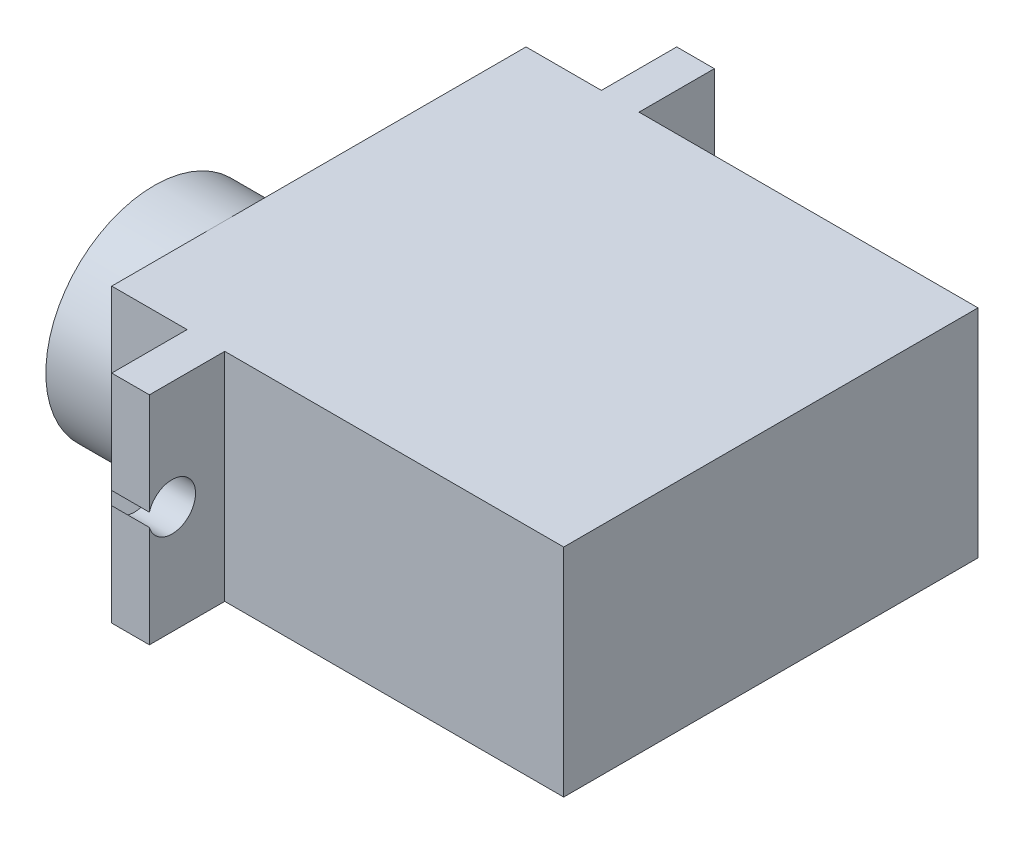
ISO-10303-21;
HEADER;
FILE_DESCRIPTION(('STEP AP214'),'2;1');
FILE_NAME('part.step','',(''),(''),'','','');
FILE_SCHEMA(('AUTOMOTIVE_DESIGN { 1 0 10303 214 1 1 1 1 }'));
ENDSEC;
DATA;
#1=APPLICATION_CONTEXT('core data for automotive mechanical design processes');
#2=APPLICATION_PROTOCOL_DEFINITION('international standard','automotive_design',2000,#1);
#3=PRODUCT_CONTEXT('',#1,'mechanical');
#4=PRODUCT('Part','Part','',(#3));
#5=PRODUCT_RELATED_PRODUCT_CATEGORY('part','',(#4));
#6=PRODUCT_DEFINITION_FORMATION('','',#4);
#7=PRODUCT_DEFINITION_CONTEXT('part definition',#1,'design');
#8=PRODUCT_DEFINITION('design','',#6,#7);
#9=PRODUCT_DEFINITION_SHAPE('','',#8);
#10=(LENGTH_UNIT() NAMED_UNIT(*) SI_UNIT(.MILLI.,.METRE.));
#11=(NAMED_UNIT(*) PLANE_ANGLE_UNIT() SI_UNIT($,.RADIAN.));
#12=(NAMED_UNIT(*) SI_UNIT($,.STERADIAN.) SOLID_ANGLE_UNIT());
#13=UNCERTAINTY_MEASURE_WITH_UNIT(LENGTH_MEASURE(1.E-05),#10,'distance_accuracy_value','');
#14=(GEOMETRIC_REPRESENTATION_CONTEXT(3) GLOBAL_UNCERTAINTY_ASSIGNED_CONTEXT((#13)) GLOBAL_UNIT_ASSIGNED_CONTEXT((#10,
#11,#12)) REPRESENTATION_CONTEXT('',''));
#15=CARTESIAN_POINT('',(0.,0.,0.));
#16=DIRECTION('',(0.,0.,1.));
#17=DIRECTION('',(1.,0.,0.));
#18=AXIS2_PLACEMENT_3D('',#15,#16,#17);
#19=CARTESIAN_POINT('',(-20.,11.5,-26.));
#20=DIRECTION('',(0.,0.,1.));
#21=DIRECTION('',(1.,0.,0.));
#22=AXIS2_PLACEMENT_3D('',#19,#20,#21);
#23=PLANE('',#22);
#24=DIRECTION('',(0.,-1.,0.));
#25=VECTOR('',#24,1.);
#26=CARTESIAN_POINT('',(-18.,11.5,-26.));
#27=LINE('',#26,#25);
#28=CARTESIAN_POINT('',(-18.,11.5,-26.));
#29=VERTEX_POINT('',#28);
#30=CARTESIAN_POINT('',(-18.,6.10000000000001,-26.));
#31=VERTEX_POINT('',#30);
#32=EDGE_CURVE('E211',#29,#31,#27,.T.);
#33=ORIENTED_EDGE('',*,*,#32,.T.);
#34=DIRECTION('',(-1.,0.,0.));
#35=VECTOR('',#34,1.);
#36=CARTESIAN_POINT('',(-16.5,6.1,-26.));
#37=LINE('',#36,#35);
#38=CARTESIAN_POINT('',(-20.,6.10000000000001,-26.));
#39=VERTEX_POINT('',#38);
#40=EDGE_CURVE('E345',#31,#39,#37,.T.);
#41=ORIENTED_EDGE('',*,*,#40,.T.);
#42=DIRECTION('',(0.,-1.,0.));
#43=VECTOR('',#42,1.);
#44=CARTESIAN_POINT('',(-20.,11.5,-26.));
#45=LINE('',#44,#43);
#46=CARTESIAN_POINT('',(-20.,11.5,-26.));
#47=VERTEX_POINT('',#46);
#48=EDGE_CURVE('E207',#47,#39,#45,.T.);
#49=ORIENTED_EDGE('',*,*,#48,.F.);
#50=DIRECTION('',(-1.,0.,0.));
#51=VECTOR('',#50,1.);
#52=CARTESIAN_POINT('',(-20.,11.5,-26.));
#53=LINE('',#52,#51);
#54=EDGE_CURVE('E265',#29,#47,#53,.T.);
#55=ORIENTED_EDGE('',*,*,#54,.F.);
#56=EDGE_LOOP('',(#33,#41,#49,#55));
#57=FACE_BOUND('',#56,.T.);
#58=ADVANCED_FACE('F36',(#57),#23,.F.);
#59=CARTESIAN_POINT('',(-20.,11.5,4.));
#60=DIRECTION('',(0.,0.,-1.));
#61=DIRECTION('',(-1.,0.,0.));
#62=AXIS2_PLACEMENT_3D('',#59,#60,#61);
#63=PLANE('',#62);
#64=DIRECTION('',(0.,-1.,0.));
#65=VECTOR('',#64,1.);
#66=CARTESIAN_POINT('',(-18.,11.5,4.));
#67=LINE('',#66,#65);
#68=CARTESIAN_POINT('',(-18.,5.4,4.));
#69=VERTEX_POINT('',#68);
#70=CARTESIAN_POINT('',(-18.,0.,4.));
#71=VERTEX_POINT('',#70);
#72=EDGE_CURVE('E316',#69,#71,#67,.T.);
#73=ORIENTED_EDGE('',*,*,#72,.F.);
#74=DIRECTION('',(-1.,0.,0.));
#75=VECTOR('',#74,1.);
#76=CARTESIAN_POINT('',(-16.5,5.39999999999999,4.));
#77=LINE('',#76,#75);
#78=CARTESIAN_POINT('',(-20.,5.4,4.));
#79=VERTEX_POINT('',#78);
#80=EDGE_CURVE('E58',#69,#79,#77,.T.);
#81=ORIENTED_EDGE('',*,*,#80,.T.);
#82=DIRECTION('',(0.,-1.,0.));
#83=VECTOR('',#82,1.);
#84=CARTESIAN_POINT('',(-20.,11.5,4.));
#85=LINE('',#84,#83);
#86=CARTESIAN_POINT('',(-20.,0.,4.));
#87=VERTEX_POINT('',#86);
#88=EDGE_CURVE('E184',#79,#87,#85,.T.);
#89=ORIENTED_EDGE('',*,*,#88,.T.);
#90=DIRECTION('',(1.,0.,0.));
#91=VECTOR('',#90,1.);
#92=CARTESIAN_POINT('',(-20.,0.,4.));
#93=LINE('',#92,#91);
#94=EDGE_CURVE('E307',#87,#71,#93,.T.);
#95=ORIENTED_EDGE('',*,*,#94,.T.);
#96=EDGE_LOOP('',(#73,#81,#89,#95));
#97=FACE_BOUND('',#96,.T.);
#98=ADVANCED_FACE('F338',(#97),#63,.F.);
#99=CARTESIAN_POINT('',(-24.,11.5,0.));
#100=DIRECTION('',(1.,0.,0.));
#101=DIRECTION('',(0.,0.,-1.));
#102=AXIS2_PLACEMENT_3D('',#99,#100,#101);
#103=PLANE('',#102);
#104=CARTESIAN_POINT('',(-24.,5.75,-11.140964663212));
#105=DIRECTION('',(-1.,0.,0.));
#106=DIRECTION('',(0.,0.,1.));
#107=AXIS2_PLACEMENT_3D('',#104,#105,#106);
#108=CIRCLE('',#107,2.);
#109=CARTESIAN_POINT('',(-24.,7.75,-11.140964663212));
#110=VERTEX_POINT('',#109);
#111=CARTESIAN_POINT('',(-24.,3.75,-11.140964663212));
#112=VERTEX_POINT('',#111);
#113=EDGE_CURVE('E233',#110,#112,#108,.T.);
#114=ORIENTED_EDGE('',*,*,#113,.F.);
#115=CARTESIAN_POINT('',(-24.,5.75,-5.75));
#116=DIRECTION('',(-1.,0.,0.));
#117=DIRECTION('',(0.,0.,1.));
#118=AXIS2_PLACEMENT_3D('',#115,#116,#117);
#119=CIRCLE('',#118,5.75);
#120=CARTESIAN_POINT('',(-24.,11.5,-5.75));
#121=VERTEX_POINT('',#120);
#122=EDGE_CURVE('E219',#121,#110,#119,.T.);
#123=ORIENTED_EDGE('',*,*,#122,.F.);
#124=DIRECTION('',(0.,0.,1.));
#125=VECTOR('',#124,1.);
#126=CARTESIAN_POINT('',(-24.,11.5,0.));
#127=LINE('',#126,#125);
#128=CARTESIAN_POINT('',(-24.,11.5,-22.));
#129=VERTEX_POINT('',#128);
#130=EDGE_CURVE('E272',#129,#121,#127,.T.);
#131=ORIENTED_EDGE('',*,*,#130,.F.);
#132=DIRECTION('',(0.,-1.,0.));
#133=VECTOR('',#132,1.);
#134=CARTESIAN_POINT('',(-24.,11.5,-22.));
#135=LINE('',#134,#133);
#136=CARTESIAN_POINT('',(-24.,0.,-22.));
#137=VERTEX_POINT('',#136);
#138=EDGE_CURVE('E200',#129,#137,#135,.T.);
#139=ORIENTED_EDGE('',*,*,#138,.T.);
#140=DIRECTION('',(0.,0.,1.));
#141=VECTOR('',#140,1.);
#142=CARTESIAN_POINT('',(-24.,0.,0.));
#143=LINE('',#142,#141);
#144=CARTESIAN_POINT('',(-24.,0.,-5.75));
#145=VERTEX_POINT('',#144);
#146=EDGE_CURVE('E300',#137,#145,#143,.T.);
#147=ORIENTED_EDGE('',*,*,#146,.T.);
#148=EDGE_CURVE('E226',#112,#145,#119,.T.);
#149=ORIENTED_EDGE('',*,*,#148,.F.);
#150=EDGE_LOOP('',(#114,#123,#131,#139,#147,#149));
#151=FACE_BOUND('',#150,.T.);
#152=ADVANCED_FACE('F375',(#151),#103,.F.);
#153=CARTESIAN_POINT('',(-24.,5.75,0.));
#154=VERTEX_POINT('',#153);
#155=EDGE_CURVE('E220',#145,#154,#119,.T.);
#156=ORIENTED_EDGE('',*,*,#155,.F.);
#157=CARTESIAN_POINT('',(-24.,0.,0.));
#158=VERTEX_POINT('',#157);
#159=EDGE_CURVE('E299',#145,#158,#143,.T.);
#160=ORIENTED_EDGE('',*,*,#159,.T.);
#161=DIRECTION('',(0.,-1.,0.));
#162=VECTOR('',#161,1.);
#163=CARTESIAN_POINT('',(-24.,11.5,0.));
#164=LINE('',#163,#162);
#165=EDGE_CURVE('E191',#154,#158,#164,.T.);
#166=ORIENTED_EDGE('',*,*,#165,.F.);
#167=EDGE_LOOP('',(#156,#160,#166));
#168=FACE_BOUND('',#167,.T.);
#169=ADVANCED_FACE('F435',(#168),#103,.F.);
#170=CARTESIAN_POINT('',(0.,11.5,0.));
#171=DIRECTION('',(-1.,0.,0.));
#172=DIRECTION('',(0.,0.,1.));
#173=AXIS2_PLACEMENT_3D('',#170,#171,#172);
#174=PLANE('',#173);
#175=DIRECTION('',(0.,0.,-1.));
#176=VECTOR('',#175,1.);
#177=CARTESIAN_POINT('',(0.,0.,0.));
#178=LINE('',#177,#176);
#179=CARTESIAN_POINT('',(0.,0.,0.));
#180=VERTEX_POINT('',#179);
#181=CARTESIAN_POINT('',(0.,0.,-22.));
#182=VERTEX_POINT('',#181);
#183=EDGE_CURVE('E253',#180,#182,#178,.T.);
#184=ORIENTED_EDGE('',*,*,#183,.T.);
#185=DIRECTION('',(0.,-1.,0.));
#186=VECTOR('',#185,1.);
#187=CARTESIAN_POINT('',(0.,11.5,-22.));
#188=LINE('',#187,#186);
#189=CARTESIAN_POINT('',(0.,11.5,-22.));
#190=VERTEX_POINT('',#189);
#191=EDGE_CURVE('E217',#190,#182,#188,.T.);
#192=ORIENTED_EDGE('',*,*,#191,.F.);
#193=DIRECTION('',(0.,0.,-1.));
#194=VECTOR('',#193,1.);
#195=CARTESIAN_POINT('',(0.,11.5,0.));
#196=LINE('',#195,#194);
#197=CARTESIAN_POINT('',(0.,11.5,0.));
#198=VERTEX_POINT('',#197);
#199=EDGE_CURVE('E257',#198,#190,#196,.T.);
#200=ORIENTED_EDGE('',*,*,#199,.F.);
#201=DIRECTION('',(0.,-1.,0.));
#202=VECTOR('',#201,1.);
#203=CARTESIAN_POINT('',(0.,11.5,0.));
#204=LINE('',#203,#202);
#205=EDGE_CURVE('E284',#198,#180,#204,.T.);
#206=ORIENTED_EDGE('',*,*,#205,.T.);
#207=EDGE_LOOP('',(#184,#192,#200,#206));
#208=FACE_BOUND('',#207,.T.);
#209=ADVANCED_FACE('F38',(#208),#174,.F.);
#210=CARTESIAN_POINT('',(0.,11.5,-22.));
#211=DIRECTION('',(0.,0.,1.));
#212=DIRECTION('',(1.,0.,0.));
#213=AXIS2_PLACEMENT_3D('',#210,#211,#212);
#214=PLANE('',#213);
#215=DIRECTION('',(-1.,0.,0.));
#216=VECTOR('',#215,1.);
#217=CARTESIAN_POINT('',(0.,0.,-22.));
#218=LINE('',#217,#216);
#219=CARTESIAN_POINT('',(-18.,0.,-22.));
#220=VERTEX_POINT('',#219);
#221=EDGE_CURVE('E287',#182,#220,#218,.T.);
#222=ORIENTED_EDGE('',*,*,#221,.T.);
#223=DIRECTION('',(0.,-1.,0.));
#224=VECTOR('',#223,1.);
#225=CARTESIAN_POINT('',(-18.,11.5,-22.));
#226=LINE('',#225,#224);
#227=CARTESIAN_POINT('',(-18.,11.5,-22.));
#228=VERTEX_POINT('',#227);
#229=EDGE_CURVE('E214',#228,#220,#226,.T.);
#230=ORIENTED_EDGE('',*,*,#229,.F.);
#231=DIRECTION('',(-1.,0.,0.));
#232=VECTOR('',#231,1.);
#233=CARTESIAN_POINT('',(0.,11.5,-22.));
#234=LINE('',#233,#232);
#235=EDGE_CURVE('E260',#190,#228,#234,.T.);
#236=ORIENTED_EDGE('',*,*,#235,.F.);
#237=ORIENTED_EDGE('',*,*,#191,.T.);
#238=EDGE_LOOP('',(#222,#230,#236,#237));
#239=FACE_BOUND('',#238,.T.);
#240=ADVANCED_FACE('F389',(#239),#214,.F.);
#241=CARTESIAN_POINT('',(-18.,11.5,-22.));
#242=DIRECTION('',(-1.,0.,0.));
#243=DIRECTION('',(0.,0.,1.));
#244=AXIS2_PLACEMENT_3D('',#241,#242,#243);
#245=PLANE('',#244);
#246=CARTESIAN_POINT('',(-18.,5.4,-26.));
#247=VERTEX_POINT('',#246);
#248=CARTESIAN_POINT('',(-18.,0.,-26.));
#249=VERTEX_POINT('',#248);
#250=EDGE_CURVE('E210',#247,#249,#27,.T.);
#251=ORIENTED_EDGE('',*,*,#250,.F.);
#252=CARTESIAN_POINT('',(-18.,5.75,-24.8));
#253=DIRECTION('',(-1.,0.,0.));
#254=DIRECTION('',(0.,0.,1.));
#255=AXIS2_PLACEMENT_3D('',#252,#253,#254);
#256=CIRCLE('',#255,1.25);
#257=EDGE_CURVE('E340',#247,#31,#256,.T.);
#258=ORIENTED_EDGE('',*,*,#257,.T.);
#259=ORIENTED_EDGE('',*,*,#32,.F.);
#260=DIRECTION('',(0.,0.,-1.));
#261=VECTOR('',#260,1.);
#262=CARTESIAN_POINT('',(-18.,11.5,-22.));
#263=LINE('',#262,#261);
#264=EDGE_CURVE('E263',#228,#29,#263,.T.);
#265=ORIENTED_EDGE('',*,*,#264,.F.);
#266=ORIENTED_EDGE('',*,*,#229,.T.);
#267=DIRECTION('',(0.,0.,-1.));
#268=VECTOR('',#267,1.);
#269=CARTESIAN_POINT('',(-18.,0.,-22.));
#270=LINE('',#269,#268);
#271=EDGE_CURVE('E289',#220,#249,#270,.T.);
#272=ORIENTED_EDGE('',*,*,#271,.T.);
#273=EDGE_LOOP('',(#251,#258,#259,#265,#266,#272));
#274=FACE_BOUND('',#273,.T.);
#275=ADVANCED_FACE('F381',(#274),#245,.F.);
#276=CARTESIAN_POINT('',(-20.,5.39999999999999,-26.));
#277=VERTEX_POINT('',#276);
#278=CARTESIAN_POINT('',(-20.,0.,-26.));
#279=VERTEX_POINT('',#278);
#280=EDGE_CURVE('E206',#277,#279,#45,.T.);
#281=ORIENTED_EDGE('',*,*,#280,.F.);
#282=DIRECTION('',(-1.,0.,0.));
#283=VECTOR('',#282,1.);
#284=CARTESIAN_POINT('',(-16.5,5.4,-26.));
#285=LINE('',#284,#283);
#286=EDGE_CURVE('E51',#277,#247,#285,.F.);
#287=ORIENTED_EDGE('',*,*,#286,.T.);
#288=ORIENTED_EDGE('',*,*,#250,.T.);
#289=DIRECTION('',(-1.,0.,0.));
#290=VECTOR('',#289,1.);
#291=CARTESIAN_POINT('',(-20.,0.,-26.));
#292=LINE('',#291,#290);
#293=EDGE_CURVE('E292',#249,#279,#292,.T.);
#294=ORIENTED_EDGE('',*,*,#293,.T.);
#295=EDGE_LOOP('',(#281,#287,#288,#294));
#296=FACE_BOUND('',#295,.T.);
#297=ADVANCED_FACE('F371',(#296),#23,.F.);
#298=CARTESIAN_POINT('',(-20.,11.5,-22.));
#299=DIRECTION('',(1.,0.,0.));
#300=DIRECTION('',(0.,0.,-1.));
#301=AXIS2_PLACEMENT_3D('',#298,#299,#300);
#302=PLANE('',#301);
#303=ORIENTED_EDGE('',*,*,#48,.T.);
#304=CARTESIAN_POINT('',(-20.,5.75,-24.8));
#305=DIRECTION('',(1.,0.,0.));
#306=DIRECTION('',(0.,0.,-1.));
#307=AXIS2_PLACEMENT_3D('',#304,#305,#306);
#308=CIRCLE('',#307,1.25);
#309=EDGE_CURVE('E11',#39,#277,#308,.T.);
#310=ORIENTED_EDGE('',*,*,#309,.T.);
#311=ORIENTED_EDGE('',*,*,#280,.T.);
#312=DIRECTION('',(0.,0.,1.));
#313=VECTOR('',#312,1.);
#314=CARTESIAN_POINT('',(-20.,0.,-22.));
#315=LINE('',#314,#313);
#316=CARTESIAN_POINT('',(-20.,0.,-22.));
#317=VERTEX_POINT('',#316);
#318=EDGE_CURVE('E295',#279,#317,#315,.T.);
#319=ORIENTED_EDGE('',*,*,#318,.T.);
#320=DIRECTION('',(0.,-1.,0.));
#321=VECTOR('',#320,1.);
#322=CARTESIAN_POINT('',(-20.,11.5,-22.));
#323=LINE('',#322,#321);
#324=CARTESIAN_POINT('',(-20.,11.5,-22.));
#325=VERTEX_POINT('',#324);
#326=EDGE_CURVE('E203',#325,#317,#323,.T.);
#327=ORIENTED_EDGE('',*,*,#326,.F.);
#328=DIRECTION('',(0.,0.,1.));
#329=VECTOR('',#328,1.);
#330=CARTESIAN_POINT('',(-20.,11.5,-22.));
#331=LINE('',#330,#329);
#332=EDGE_CURVE('E267',#47,#325,#331,.T.);
#333=ORIENTED_EDGE('',*,*,#332,.F.);
#334=EDGE_LOOP('',(#303,#310,#311,#319,#327,#333));
#335=FACE_BOUND('',#334,.T.);
#336=ADVANCED_FACE('F380',(#335),#302,.F.);
#337=CARTESIAN_POINT('',(-20.,11.5,-22.));
#338=DIRECTION('',(0.,0.,1.));
#339=DIRECTION('',(1.,0.,0.));
#340=AXIS2_PLACEMENT_3D('',#337,#338,#339);
#341=PLANE('',#340);
#342=DIRECTION('',(-1.,0.,0.));
#343=VECTOR('',#342,1.);
#344=CARTESIAN_POINT('',(-20.,0.,-22.));
#345=LINE('',#344,#343);
#346=EDGE_CURVE('E297',#317,#137,#345,.T.);
#347=ORIENTED_EDGE('',*,*,#346,.T.);
#348=ORIENTED_EDGE('',*,*,#138,.F.);
#349=DIRECTION('',(-1.,0.,0.));
#350=VECTOR('',#349,1.);
#351=CARTESIAN_POINT('',(-20.,11.5,-22.));
#352=LINE('',#351,#350);
#353=EDGE_CURVE('E269',#325,#129,#352,.T.);
#354=ORIENTED_EDGE('',*,*,#353,.F.);
#355=ORIENTED_EDGE('',*,*,#326,.T.);
#356=EDGE_LOOP('',(#347,#348,#354,#355));
#357=FACE_BOUND('',#356,.T.);
#358=ADVANCED_FACE('F387',(#357),#341,.F.);
#359=EDGE_CURVE('E224',#154,#121,#119,.T.);
#360=ORIENTED_EDGE('',*,*,#359,.F.);
#361=CARTESIAN_POINT('',(-24.,11.5,0.));
#362=VERTEX_POINT('',#361);
#363=EDGE_CURVE('E197',#362,#154,#164,.T.);
#364=ORIENTED_EDGE('',*,*,#363,.F.);
#365=EDGE_CURVE('E271',#121,#362,#127,.T.);
#366=ORIENTED_EDGE('',*,*,#365,.F.);
#367=EDGE_LOOP('',(#360,#364,#366));
#368=FACE_BOUND('',#367,.T.);
#369=ADVANCED_FACE('F431',(#368),#103,.F.);
#370=CARTESIAN_POINT('',(-20.,11.5,0.));
#371=DIRECTION('',(0.,0.,-1.));
#372=DIRECTION('',(-1.,0.,0.));
#373=AXIS2_PLACEMENT_3D('',#370,#371,#372);
#374=PLANE('',#373);
#375=DIRECTION('',(1.,0.,0.));
#376=VECTOR('',#375,1.);
#377=CARTESIAN_POINT('',(-20.,0.,0.));
#378=LINE('',#377,#376);
#379=CARTESIAN_POINT('',(-20.,0.,0.));
#380=VERTEX_POINT('',#379);
#381=EDGE_CURVE('E303',#158,#380,#378,.T.);
#382=ORIENTED_EDGE('',*,*,#381,.T.);
#383=DIRECTION('',(0.,-1.,0.));
#384=VECTOR('',#383,1.);
#385=CARTESIAN_POINT('',(-20.,11.5,0.));
#386=LINE('',#385,#384);
#387=CARTESIAN_POINT('',(-20.,11.5,0.));
#388=VERTEX_POINT('',#387);
#389=EDGE_CURVE('E188',#388,#380,#386,.T.);
#390=ORIENTED_EDGE('',*,*,#389,.F.);
#391=DIRECTION('',(1.,0.,0.));
#392=VECTOR('',#391,1.);
#393=CARTESIAN_POINT('',(-20.,11.5,0.));
#394=LINE('',#393,#392);
#395=EDGE_CURVE('E275',#362,#388,#394,.T.);
#396=ORIENTED_EDGE('',*,*,#395,.F.);
#397=ORIENTED_EDGE('',*,*,#363,.T.);
#398=ORIENTED_EDGE('',*,*,#165,.T.);
#399=EDGE_LOOP('',(#382,#390,#396,#397,#398));
#400=FACE_BOUND('',#399,.T.);
#401=ADVANCED_FACE('F428',(#400),#374,.F.);
#402=CARTESIAN_POINT('',(-20.,11.5,0.));
#403=DIRECTION('',(1.,0.,0.));
#404=DIRECTION('',(0.,0.,-1.));
#405=AXIS2_PLACEMENT_3D('',#402,#403,#404);
#406=PLANE('',#405);
#407=ORIENTED_EDGE('',*,*,#88,.F.);
#408=CARTESIAN_POINT('',(-20.,5.75,2.8));
#409=DIRECTION('',(-1.,0.,0.));
#410=DIRECTION('',(0.,0.,1.));
#411=AXIS2_PLACEMENT_3D('',#408,#409,#410);
#412=CIRCLE('',#411,1.25);
#413=CARTESIAN_POINT('',(-20.,6.1,4.));
#414=VERTEX_POINT('',#413);
#415=EDGE_CURVE('E170',#414,#79,#412,.T.);
#416=ORIENTED_EDGE('',*,*,#415,.F.);
#417=CARTESIAN_POINT('',(-20.,11.5,4.));
#418=VERTEX_POINT('',#417);
#419=EDGE_CURVE('E181',#418,#414,#85,.T.);
#420=ORIENTED_EDGE('',*,*,#419,.F.);
#421=DIRECTION('',(0.,0.,1.));
#422=VECTOR('',#421,1.);
#423=CARTESIAN_POINT('',(-20.,11.5,0.));
#424=LINE('',#423,#422);
#425=EDGE_CURVE('E277',#388,#418,#424,.T.);
#426=ORIENTED_EDGE('',*,*,#425,.F.);
#427=ORIENTED_EDGE('',*,*,#389,.T.);
#428=DIRECTION('',(0.,0.,1.));
#429=VECTOR('',#428,1.);
#430=CARTESIAN_POINT('',(-20.,0.,0.));
#431=LINE('',#430,#429);
#432=EDGE_CURVE('E305',#380,#87,#431,.T.);
#433=ORIENTED_EDGE('',*,*,#432,.T.);
#434=EDGE_LOOP('',(#407,#416,#420,#426,#427,#433));
#435=FACE_BOUND('',#434,.T.);
#436=ADVANCED_FACE('F179',(#435),#406,.F.);
#437=ORIENTED_EDGE('',*,*,#419,.T.);
#438=DIRECTION('',(-1.,0.,0.));
#439=VECTOR('',#438,1.);
#440=CARTESIAN_POINT('',(-16.5,6.10000000000001,4.));
#441=LINE('',#440,#439);
#442=CARTESIAN_POINT('',(-18.,6.1,4.));
#443=VERTEX_POINT('',#442);
#444=EDGE_CURVE('E167',#414,#443,#441,.F.);
#445=ORIENTED_EDGE('',*,*,#444,.T.);
#446=CARTESIAN_POINT('',(-18.,11.5,4.));
#447=VERTEX_POINT('',#446);
#448=EDGE_CURVE('E193',#447,#443,#67,.T.);
#449=ORIENTED_EDGE('',*,*,#448,.F.);
#450=DIRECTION('',(1.,0.,0.));
#451=VECTOR('',#450,1.);
#452=CARTESIAN_POINT('',(-20.,11.5,4.));
#453=LINE('',#452,#451);
#454=EDGE_CURVE('E187',#418,#447,#453,.T.);
#455=ORIENTED_EDGE('',*,*,#454,.F.);
#456=EDGE_LOOP('',(#437,#445,#449,#455));
#457=FACE_BOUND('',#456,.T.);
#458=ADVANCED_FACE('F186',(#457),#63,.F.);
#459=CARTESIAN_POINT('',(-18.,11.5,0.));
#460=DIRECTION('',(-1.,0.,0.));
#461=DIRECTION('',(0.,0.,1.));
#462=AXIS2_PLACEMENT_3D('',#459,#460,#461);
#463=PLANE('',#462);
#464=ORIENTED_EDGE('',*,*,#448,.T.);
#465=CARTESIAN_POINT('',(-18.,5.75,2.8));
#466=DIRECTION('',(-1.,0.,0.));
#467=DIRECTION('',(0.,0.,1.));
#468=AXIS2_PLACEMENT_3D('',#465,#466,#467);
#469=CIRCLE('',#468,1.25);
#470=EDGE_CURVE('E44',#443,#69,#469,.T.);
#471=ORIENTED_EDGE('',*,*,#470,.T.);
#472=ORIENTED_EDGE('',*,*,#72,.T.);
#473=DIRECTION('',(0.,0.,-1.));
#474=VECTOR('',#473,1.);
#475=CARTESIAN_POINT('',(-18.,0.,0.));
#476=LINE('',#475,#474);
#477=CARTESIAN_POINT('',(-18.,0.,0.));
#478=VERTEX_POINT('',#477);
#479=EDGE_CURVE('E310',#71,#478,#476,.T.);
#480=ORIENTED_EDGE('',*,*,#479,.T.);
#481=DIRECTION('',(0.,-1.,0.));
#482=VECTOR('',#481,1.);
#483=CARTESIAN_POINT('',(-18.,11.5,0.));
#484=LINE('',#483,#482);
#485=CARTESIAN_POINT('',(-18.,11.5,0.));
#486=VERTEX_POINT('',#485);
#487=EDGE_CURVE('E314',#486,#478,#484,.T.);
#488=ORIENTED_EDGE('',*,*,#487,.F.);
#489=DIRECTION('',(0.,0.,-1.));
#490=VECTOR('',#489,1.);
#491=CARTESIAN_POINT('',(-18.,11.5,0.));
#492=LINE('',#491,#490);
#493=EDGE_CURVE('E280',#447,#486,#492,.T.);
#494=ORIENTED_EDGE('',*,*,#493,.F.);
#495=EDGE_LOOP('',(#464,#471,#472,#480,#488,#494));
#496=FACE_BOUND('',#495,.T.);
#497=ADVANCED_FACE('F322',(#496),#463,.F.);
#498=CARTESIAN_POINT('',(0.,11.5,0.));
#499=DIRECTION('',(0.,0.,-1.));
#500=DIRECTION('',(-1.,0.,0.));
#501=AXIS2_PLACEMENT_3D('',#498,#499,#500);
#502=PLANE('',#501);
#503=DIRECTION('',(1.,0.,0.));
#504=VECTOR('',#503,1.);
#505=CARTESIAN_POINT('',(0.,0.,0.));
#506=LINE('',#505,#504);
#507=EDGE_CURVE('E261',#478,#180,#506,.T.);
#508=ORIENTED_EDGE('',*,*,#507,.T.);
#509=ORIENTED_EDGE('',*,*,#205,.F.);
#510=DIRECTION('',(1.,0.,0.));
#511=VECTOR('',#510,1.);
#512=CARTESIAN_POINT('',(0.,11.5,0.));
#513=LINE('',#512,#511);
#514=EDGE_CURVE('E282',#486,#198,#513,.T.);
#515=ORIENTED_EDGE('',*,*,#514,.F.);
#516=ORIENTED_EDGE('',*,*,#487,.T.);
#517=EDGE_LOOP('',(#508,#509,#515,#516));
#518=FACE_BOUND('',#517,.T.);
#519=ADVANCED_FACE('F414',(#518),#502,.F.);
#520=CARTESIAN_POINT('',(0.,11.5,0.));
#521=DIRECTION('',(0.,1.,0.));
#522=DIRECTION('',(0.,0.,1.));
#523=AXIS2_PLACEMENT_3D('',#520,#521,#522);
#524=PLANE('',#523);
#525=ORIENTED_EDGE('',*,*,#199,.T.);
#526=ORIENTED_EDGE('',*,*,#235,.T.);
#527=ORIENTED_EDGE('',*,*,#264,.T.);
#528=ORIENTED_EDGE('',*,*,#54,.T.);
#529=ORIENTED_EDGE('',*,*,#332,.T.);
#530=ORIENTED_EDGE('',*,*,#353,.T.);
#531=ORIENTED_EDGE('',*,*,#130,.T.);
#532=ORIENTED_EDGE('',*,*,#365,.T.);
#533=ORIENTED_EDGE('',*,*,#395,.T.);
#534=ORIENTED_EDGE('',*,*,#425,.T.);
#535=ORIENTED_EDGE('',*,*,#454,.T.);
#536=ORIENTED_EDGE('',*,*,#493,.T.);
#537=ORIENTED_EDGE('',*,*,#514,.T.);
#538=EDGE_LOOP('',(#525,#526,#527,#528,#529,#530,#531,#532,#533,#534,#535,#536,#537));
#539=FACE_BOUND('',#538,.T.);
#540=ADVANCED_FACE('F324',(#539),#524,.T.);
#541=CARTESIAN_POINT('',(0.,0.,0.));
#542=DIRECTION('',(0.,1.,0.));
#543=DIRECTION('',(0.,0.,1.));
#544=AXIS2_PLACEMENT_3D('',#541,#542,#543);
#545=PLANE('',#544);
#546=ORIENTED_EDGE('',*,*,#183,.F.);
#547=ORIENTED_EDGE('',*,*,#507,.F.);
#548=ORIENTED_EDGE('',*,*,#479,.F.);
#549=ORIENTED_EDGE('',*,*,#94,.F.);
#550=ORIENTED_EDGE('',*,*,#432,.F.);
#551=ORIENTED_EDGE('',*,*,#381,.F.);
#552=ORIENTED_EDGE('',*,*,#159,.F.);
#553=ORIENTED_EDGE('',*,*,#146,.F.);
#554=ORIENTED_EDGE('',*,*,#346,.F.);
#555=ORIENTED_EDGE('',*,*,#318,.F.);
#556=ORIENTED_EDGE('',*,*,#293,.F.);
#557=ORIENTED_EDGE('',*,*,#271,.F.);
#558=ORIENTED_EDGE('',*,*,#221,.F.);
#559=EDGE_LOOP('',(#546,#547,#548,#549,#550,#551,#552,#553,#554,#555,#556,#557,#558));
#560=FACE_BOUND('',#559,.T.);
#561=ADVANCED_FACE('F334',(#560),#545,.F.);
#562=CARTESIAN_POINT('',(-27.5,5.75,-11.140964663212));
#563=DIRECTION('',(1.,0.,0.));
#564=DIRECTION('',(0.,0.,-1.));
#565=AXIS2_PLACEMENT_3D('',#562,#563,#564);
#566=CYLINDRICAL_SURFACE('',#565,2.);
#567=ORIENTED_EDGE('',*,*,#113,.T.);
#568=DIRECTION('',(1.,0.,0.));
#569=VECTOR('',#568,1.);
#570=CARTESIAN_POINT('',(-27.5,3.75,-11.140964663212));
#571=LINE('',#570,#569);
#572=CARTESIAN_POINT('',(-27.5,3.75,-11.140964663212));
#573=VERTEX_POINT('',#572);
#574=EDGE_CURVE('E252',#573,#112,#571,.T.);
#575=ORIENTED_EDGE('',*,*,#574,.F.);
#576=CARTESIAN_POINT('',(-27.5,5.75,-11.140964663212));
#577=DIRECTION('',(-1.,0.,0.));
#578=DIRECTION('',(0.,0.,1.));
#579=AXIS2_PLACEMENT_3D('',#576,#577,#578);
#580=CIRCLE('',#579,2.);
#581=CARTESIAN_POINT('',(-27.5,7.75,-11.140964663212));
#582=VERTEX_POINT('',#581);
#583=EDGE_CURVE('E232',#582,#573,#580,.T.);
#584=ORIENTED_EDGE('',*,*,#583,.F.);
#585=DIRECTION('',(1.,0.,0.));
#586=VECTOR('',#585,1.);
#587=CARTESIAN_POINT('',(-27.5,7.75,-11.140964663212));
#588=LINE('',#587,#586);
#589=EDGE_CURVE('E244',#582,#110,#588,.T.);
#590=ORIENTED_EDGE('',*,*,#589,.T.);
#591=EDGE_LOOP('',(#567,#575,#584,#590));
#592=FACE_BOUND('',#591,.T.);
#593=ADVANCED_FACE('F250',(#592),#566,.T.);
#594=CARTESIAN_POINT('',(-27.5,5.75,-5.75));
#595=DIRECTION('',(1.,0.,0.));
#596=DIRECTION('',(0.,0.,-1.));
#597=AXIS2_PLACEMENT_3D('',#594,#595,#596);
#598=CYLINDRICAL_SURFACE('',#597,5.75);
#599=ORIENTED_EDGE('',*,*,#148,.T.);
#600=ORIENTED_EDGE('',*,*,#155,.T.);
#601=ORIENTED_EDGE('',*,*,#359,.T.);
#602=ORIENTED_EDGE('',*,*,#122,.T.);
#603=ORIENTED_EDGE('',*,*,#589,.F.);
#604=CARTESIAN_POINT('',(-27.5,5.75,-5.75));
#605=DIRECTION('',(-1.,0.,0.));
#606=DIRECTION('',(0.,0.,1.));
#607=AXIS2_PLACEMENT_3D('',#604,#605,#606);
#608=CIRCLE('',#607,5.75);
#609=EDGE_CURVE('E236',#573,#582,#608,.T.);
#610=ORIENTED_EDGE('',*,*,#609,.F.);
#611=ORIENTED_EDGE('',*,*,#574,.T.);
#612=EDGE_LOOP('',(#599,#600,#601,#602,#603,#610,#611));
#613=FACE_BOUND('',#612,.T.);
#614=ADVANCED_FACE('F243',(#613),#598,.T.);
#615=CARTESIAN_POINT('',(-27.5,5.75,-8.44548233160598));
#616=DIRECTION('',(-1.,0.,0.));
#617=DIRECTION('',(0.,0.,1.));
#618=AXIS2_PLACEMENT_3D('',#615,#616,#617);
#619=PLANE('',#618);
#620=CARTESIAN_POINT('',(-27.5,5.75,-5.75));
#621=DIRECTION('',(-1.,0.,0.));
#622=DIRECTION('',(0.,0.,1.));
#623=AXIS2_PLACEMENT_3D('',#620,#621,#622);
#624=CIRCLE('',#623,1.5);
#625=CARTESIAN_POINT('',(-27.5,5.75,-4.25));
#626=VERTEX_POINT('',#625);
#627=EDGE_CURVE('E348',#626,#626,#624,.T.);
#628=ORIENTED_EDGE('',*,*,#627,.F.);
#629=EDGE_LOOP('',(#628));
#630=FACE_BOUND('',#629,.T.);
#631=ORIENTED_EDGE('',*,*,#583,.T.);
#632=ORIENTED_EDGE('',*,*,#609,.T.);
#633=EDGE_LOOP('',(#631,#632));
#634=FACE_BOUND('',#633,.T.);
#635=ADVANCED_FACE('F356',(#630,#634),#619,.T.);
#636=CARTESIAN_POINT('',(-30.5,5.75,-5.75));
#637=DIRECTION('',(1.,0.,0.));
#638=DIRECTION('',(0.,0.,-1.));
#639=AXIS2_PLACEMENT_3D('',#636,#637,#638);
#640=CYLINDRICAL_SURFACE('',#639,1.5);
#641=CARTESIAN_POINT('',(-30.5,5.75,-5.75));
#642=DIRECTION('',(-1.,0.,0.));
#643=DIRECTION('',(0.,0.,1.));
#644=AXIS2_PLACEMENT_3D('',#641,#642,#643);
#645=CIRCLE('',#644,1.5);
#646=CARTESIAN_POINT('',(-30.5,5.75,-4.25));
#647=VERTEX_POINT('',#646);
#648=EDGE_CURVE('E239',#647,#647,#645,.T.);
#649=ORIENTED_EDGE('',*,*,#648,.F.);
#650=EDGE_LOOP('',(#649));
#651=FACE_BOUND('',#650,.T.);
#652=ORIENTED_EDGE('',*,*,#627,.T.);
#653=EDGE_LOOP('',(#652));
#654=FACE_BOUND('',#653,.T.);
#655=ADVANCED_FACE('F354',(#651,#654),#640,.T.);
#656=CARTESIAN_POINT('',(-30.5,5.75,-5.75));
#657=DIRECTION('',(-1.,0.,0.));
#658=DIRECTION('',(0.,0.,1.));
#659=AXIS2_PLACEMENT_3D('',#656,#657,#658);
#660=PLANE('',#659);
#661=ORIENTED_EDGE('',*,*,#648,.T.);
#662=EDGE_LOOP('',(#661));
#663=FACE_BOUND('',#662,.T.);
#664=ADVANCED_FACE('F364',(#663),#660,.T.);
#665=CARTESIAN_POINT('',(-16.5,5.75,2.8));
#666=DIRECTION('',(-1.,0.,0.));
#667=DIRECTION('',(0.,0.,1.));
#668=AXIS2_PLACEMENT_3D('',#665,#666,#667);
#669=CYLINDRICAL_SURFACE('',#668,1.25);
#670=ORIENTED_EDGE('',*,*,#470,.F.);
#671=ORIENTED_EDGE('',*,*,#444,.F.);
#672=ORIENTED_EDGE('',*,*,#415,.T.);
#673=ORIENTED_EDGE('',*,*,#80,.F.);
#674=EDGE_LOOP('',(#670,#671,#672,#673));
#675=FACE_BOUND('',#674,.T.);
#676=ADVANCED_FACE('F169',(#675),#669,.F.);
#677=CARTESIAN_POINT('',(-16.5,5.75,-24.8));
#678=DIRECTION('',(-1.,0.,0.));
#679=DIRECTION('',(0.,0.,1.));
#680=AXIS2_PLACEMENT_3D('',#677,#678,#679);
#681=CYLINDRICAL_SURFACE('',#680,1.25);
#682=ORIENTED_EDGE('',*,*,#257,.F.);
#683=ORIENTED_EDGE('',*,*,#286,.F.);
#684=ORIENTED_EDGE('',*,*,#309,.F.);
#685=ORIENTED_EDGE('',*,*,#40,.F.);
#686=EDGE_LOOP('',(#682,#683,#684,#685));
#687=FACE_BOUND('',#686,.T.);
#688=ADVANCED_FACE('F398',(#687),#681,.F.);
#689=CLOSED_SHELL('',(#58,#98,#152,#169,#209,#240,#275,#297,#336,#358,#369,#401,#436,#458,#497,
#519,#540,#561,#593,#614,#635,#655,#664,#676,#688));
#690=MANIFOLD_SOLID_BREP('B2',#689);
#691=ADVANCED_BREP_SHAPE_REPRESENTATION('',(#18,#690),#14);
#692=SHAPE_DEFINITION_REPRESENTATION(#9,#691);
ENDSEC;
END-ISO-10303-21;
